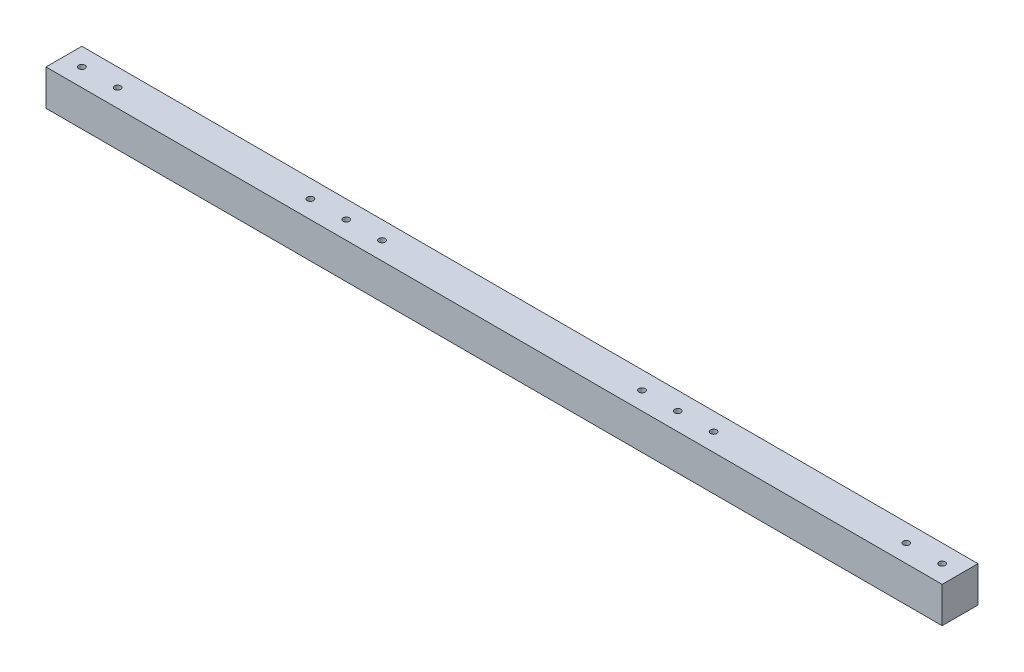
ISO-10303-21;
HEADER;
FILE_DESCRIPTION(('STEP AP214'),'2;1');
FILE_NAME('part.step','',(''),(''),'','','');
FILE_SCHEMA(('AUTOMOTIVE_DESIGN { 1 0 10303 214 1 1 1 1 }'));
ENDSEC;
DATA;
#1=APPLICATION_CONTEXT('core data for automotive mechanical design processes');
#2=APPLICATION_PROTOCOL_DEFINITION('international standard','automotive_design',2000,#1);
#3=PRODUCT_CONTEXT('',#1,'mechanical');
#4=PRODUCT('Part','Part','',(#3));
#5=PRODUCT_RELATED_PRODUCT_CATEGORY('part','',(#4));
#6=PRODUCT_DEFINITION_FORMATION('','',#4);
#7=PRODUCT_DEFINITION_CONTEXT('part definition',#1,'design');
#8=PRODUCT_DEFINITION('design','',#6,#7);
#9=PRODUCT_DEFINITION_SHAPE('','',#8);
#10=(LENGTH_UNIT() NAMED_UNIT(*) SI_UNIT(.MILLI.,.METRE.));
#11=(NAMED_UNIT(*) PLANE_ANGLE_UNIT() SI_UNIT($,.RADIAN.));
#12=(NAMED_UNIT(*) SI_UNIT($,.STERADIAN.) SOLID_ANGLE_UNIT());
#13=UNCERTAINTY_MEASURE_WITH_UNIT(LENGTH_MEASURE(1.E-05),#10,'distance_accuracy_value','');
#14=(GEOMETRIC_REPRESENTATION_CONTEXT(3) GLOBAL_UNCERTAINTY_ASSIGNED_CONTEXT((#13)) GLOBAL_UNIT_ASSIGNED_CONTEXT((#10,
#11,#12)) REPRESENTATION_CONTEXT('',''));
#15=CARTESIAN_POINT('',(0.,0.,0.));
#16=DIRECTION('',(0.,0.,1.));
#17=DIRECTION('',(1.,0.,0.));
#18=AXIS2_PLACEMENT_3D('',#15,#16,#17);
#19=CARTESIAN_POINT('',(0.,20.,0.));
#20=DIRECTION('',(0.,1.,0.));
#21=DIRECTION('',(0.,0.,1.));
#22=AXIS2_PLACEMENT_3D('',#19,#20,#21);
#23=PLANE('',#22);
#24=CARTESIAN_POINT('',(-72.5,20.,0.));
#25=DIRECTION('',(0.,1.,0.));
#26=DIRECTION('',(0.,0.,1.));
#27=AXIS2_PLACEMENT_3D('',#24,#25,#26);
#28=CIRCLE('',#27,1.75);
#29=CARTESIAN_POINT('',(-72.5,20.,1.75000000000001));
#30=VERTEX_POINT('',#29);
#31=EDGE_CURVE('E186',#30,#30,#28,.F.);
#32=ORIENTED_EDGE('',*,*,#31,.T.);
#33=EDGE_LOOP('',(#32));
#34=FACE_BOUND('',#33,.T.);
#35=CARTESIAN_POINT('',(-112.5,20.,-1.30985636173841E-13));
#36=DIRECTION('',(0.,1.,0.));
#37=DIRECTION('',(0.,0.,1.));
#38=AXIS2_PLACEMENT_3D('',#35,#36,#37);
#39=CIRCLE('',#38,1.75);
#40=CARTESIAN_POINT('',(-112.5,20.,1.74999999999987));
#41=VERTEX_POINT('',#40);
#42=EDGE_CURVE('E220',#41,#41,#39,.F.);
#43=ORIENTED_EDGE('',*,*,#42,.T.);
#44=EDGE_LOOP('',(#43));
#45=FACE_BOUND('',#44,.T.);
#46=CARTESIAN_POINT('',(112.5,20.,-1.03431083193026E-13));
#47=DIRECTION('',(0.,1.,0.));
#48=DIRECTION('',(0.,0.,1.));
#49=AXIS2_PLACEMENT_3D('',#46,#47,#48);
#50=CIRCLE('',#49,1.75);
#51=CARTESIAN_POINT('',(112.5,20.,1.74999999999989));
#52=VERTEX_POINT('',#51);
#53=EDGE_CURVE('E224',#52,#52,#50,.F.);
#54=ORIENTED_EDGE('',*,*,#53,.T.);
#55=EDGE_LOOP('',(#54));
#56=FACE_BOUND('',#55,.T.);
#57=CARTESIAN_POINT('',(92.5,20.,0.));
#58=DIRECTION('',(0.,1.,0.));
#59=DIRECTION('',(0.,0.,1.));
#60=AXIS2_PLACEMENT_3D('',#57,#58,#59);
#61=CIRCLE('',#60,1.75);
#62=CARTESIAN_POINT('',(92.5,20.,1.75000000000003));
#63=VERTEX_POINT('',#62);
#64=EDGE_CURVE('E198',#63,#63,#61,.F.);
#65=ORIENTED_EDGE('',*,*,#64,.T.);
#66=EDGE_LOOP('',(#65));
#67=FACE_BOUND('',#66,.T.);
#68=CARTESIAN_POINT('',(72.5,20.,0.));
#69=DIRECTION('',(0.,1.,0.));
#70=DIRECTION('',(0.,0.,1.));
#71=AXIS2_PLACEMENT_3D('',#68,#69,#70);
#72=CIRCLE('',#71,1.75);
#73=CARTESIAN_POINT('',(72.5,20.,1.75000000000002));
#74=VERTEX_POINT('',#73);
#75=EDGE_CURVE('E200',#74,#74,#72,.F.);
#76=ORIENTED_EDGE('',*,*,#75,.T.);
#77=EDGE_LOOP('',(#76));
#78=FACE_BOUND('',#77,.T.);
#79=CARTESIAN_POINT('',(-92.5,20.,0.));
#80=DIRECTION('',(0.,1.,0.));
#81=DIRECTION('',(0.,0.,1.));
#82=AXIS2_PLACEMENT_3D('',#79,#80,#81);
#83=CIRCLE('',#82,1.75);
#84=CARTESIAN_POINT('',(-92.5,20.,1.75000000000001));
#85=VERTEX_POINT('',#84);
#86=EDGE_CURVE('E183',#85,#85,#83,.F.);
#87=ORIENTED_EDGE('',*,*,#86,.T.);
#88=EDGE_LOOP('',(#87));
#89=FACE_BOUND('',#88,.T.);
#90=CARTESIAN_POINT('',(-240.000000000001,20.,0.));
#91=DIRECTION('',(0.,1.,0.));
#92=DIRECTION('',(0.,0.,-1.));
#93=AXIS2_PLACEMENT_3D('',#90,#91,#92);
#94=CIRCLE('',#93,1.75000000000001);
#95=CARTESIAN_POINT('',(-240.000000000001,20.,-1.75000000000001));
#96=VERTEX_POINT('',#95);
#97=EDGE_CURVE('E161',#96,#96,#94,.T.);
#98=ORIENTED_EDGE('',*,*,#97,.F.);
#99=EDGE_LOOP('',(#98));
#100=FACE_BOUND('',#99,.T.);
#101=CARTESIAN_POINT('',(240.,20.,0.));
#102=DIRECTION('',(0.,1.,0.));
#103=DIRECTION('',(0.,0.,1.));
#104=AXIS2_PLACEMENT_3D('',#101,#102,#103);
#105=CIRCLE('',#104,1.75000000000001);
#106=CARTESIAN_POINT('',(240.,20.,1.75000000000001));
#107=VERTEX_POINT('',#106);
#108=EDGE_CURVE('E122',#107,#107,#105,.T.);
#109=ORIENTED_EDGE('',*,*,#108,.F.);
#110=EDGE_LOOP('',(#109));
#111=FACE_BOUND('',#110,.T.);
#112=DIRECTION('',(0.,0.,-1.));
#113=VECTOR('',#112,1.);
#114=CARTESIAN_POINT('',(250.,20.,-10.));
#115=LINE('',#114,#113);
#116=CARTESIAN_POINT('',(250.,20.,10.));
#117=VERTEX_POINT('',#116);
#118=CARTESIAN_POINT('',(250.,20.,-10.));
#119=VERTEX_POINT('',#118);
#120=EDGE_CURVE('E102',#117,#119,#115,.T.);
#121=ORIENTED_EDGE('',*,*,#120,.T.);
#122=DIRECTION('',(-1.,0.,0.));
#123=VECTOR('',#122,1.);
#124=CARTESIAN_POINT('',(-250.,20.,-10.));
#125=LINE('',#124,#123);
#126=CARTESIAN_POINT('',(-250.,20.,-10.));
#127=VERTEX_POINT('',#126);
#128=EDGE_CURVE('E96',#119,#127,#125,.T.);
#129=ORIENTED_EDGE('',*,*,#128,.T.);
#130=DIRECTION('',(0.,0.,1.));
#131=VECTOR('',#130,1.);
#132=CARTESIAN_POINT('',(-250.,20.,-10.));
#133=LINE('',#132,#131);
#134=CARTESIAN_POINT('',(-250.,20.,10.));
#135=VERTEX_POINT('',#134);
#136=EDGE_CURVE('E98',#127,#135,#133,.T.);
#137=ORIENTED_EDGE('',*,*,#136,.T.);
#138=DIRECTION('',(1.,0.,0.));
#139=VECTOR('',#138,1.);
#140=CARTESIAN_POINT('',(-250.,20.,10.));
#141=LINE('',#140,#139);
#142=EDGE_CURVE('E67',#135,#117,#141,.T.);
#143=ORIENTED_EDGE('',*,*,#142,.T.);
#144=EDGE_LOOP('',(#121,#129,#137,#143));
#145=FACE_BOUND('',#144,.T.);
#146=CARTESIAN_POINT('',(220.,20.,1.41393977029702E-13));
#147=DIRECTION('',(0.,1.,0.));
#148=DIRECTION('',(0.,0.,1.));
#149=AXIS2_PLACEMENT_3D('',#146,#147,#148);
#150=CIRCLE('',#149,1.75000000000001);
#151=CARTESIAN_POINT('',(220.,20.,1.75000000000015));
#152=VERTEX_POINT('',#151);
#153=EDGE_CURVE('E151',#152,#152,#150,.T.);
#154=ORIENTED_EDGE('',*,*,#153,.F.);
#155=EDGE_LOOP('',(#154));
#156=FACE_BOUND('',#155,.T.);
#157=CARTESIAN_POINT('',(-220.000000000001,20.,1.41393977029702E-13));
#158=DIRECTION('',(0.,1.,0.));
#159=DIRECTION('',(0.,0.,-1.));
#160=AXIS2_PLACEMENT_3D('',#157,#158,#159);
#161=CIRCLE('',#160,1.75000000000001);
#162=CARTESIAN_POINT('',(-220.000000000001,20.,-1.74999999999987));
#163=VERTEX_POINT('',#162);
#164=EDGE_CURVE('E173',#163,#163,#161,.T.);
#165=ORIENTED_EDGE('',*,*,#164,.F.);
#166=EDGE_LOOP('',(#165));
#167=FACE_BOUND('',#166,.T.);
#168=ADVANCED_FACE('F48',(#34,#45,#56,#67,#78,#89,#100,#111,#145,#156,#167),#23,.T.);
#169=CARTESIAN_POINT('',(0.,0.,0.));
#170=DIRECTION('',(0.,1.,0.));
#171=DIRECTION('',(0.,0.,1.));
#172=AXIS2_PLACEMENT_3D('',#169,#170,#171);
#173=PLANE('',#172);
#174=CARTESIAN_POINT('',(-72.5,0.,0.));
#175=DIRECTION('',(0.,-1.,0.));
#176=DIRECTION('',(0.,0.,-1.));
#177=AXIS2_PLACEMENT_3D('',#174,#175,#176);
#178=CIRCLE('',#177,1.75);
#179=CARTESIAN_POINT('',(-72.5,0.,-1.74999999999999));
#180=VERTEX_POINT('',#179);
#181=EDGE_CURVE('E212',#180,#180,#178,.T.);
#182=ORIENTED_EDGE('',*,*,#181,.F.);
#183=EDGE_LOOP('',(#182));
#184=FACE_BOUND('',#183,.T.);
#185=CARTESIAN_POINT('',(-112.5,0.,-1.30985636173841E-13));
#186=DIRECTION('',(0.,-1.,0.));
#187=DIRECTION('',(0.,0.,-1.));
#188=AXIS2_PLACEMENT_3D('',#185,#186,#187);
#189=CIRCLE('',#188,1.75);
#190=CARTESIAN_POINT('',(-112.5,0.,-1.75000000000013));
#191=VERTEX_POINT('',#190);
#192=EDGE_CURVE('E217',#191,#191,#189,.T.);
#193=ORIENTED_EDGE('',*,*,#192,.F.);
#194=EDGE_LOOP('',(#193));
#195=FACE_BOUND('',#194,.T.);
#196=CARTESIAN_POINT('',(112.5,0.,-1.03431083193026E-13));
#197=DIRECTION('',(0.,-1.,0.));
#198=DIRECTION('',(0.,0.,1.));
#199=AXIS2_PLACEMENT_3D('',#196,#197,#198);
#200=CIRCLE('',#199,1.75);
#201=CARTESIAN_POINT('',(112.5,0.,1.74999999999989));
#202=VERTEX_POINT('',#201);
#203=EDGE_CURVE('E228',#202,#202,#200,.T.);
#204=ORIENTED_EDGE('',*,*,#203,.F.);
#205=EDGE_LOOP('',(#204));
#206=FACE_BOUND('',#205,.T.);
#207=CARTESIAN_POINT('',(92.5,0.,0.));
#208=DIRECTION('',(0.,-1.,0.));
#209=DIRECTION('',(0.,0.,1.));
#210=AXIS2_PLACEMENT_3D('',#207,#208,#209);
#211=CIRCLE('',#210,1.75);
#212=CARTESIAN_POINT('',(92.5,0.,1.75000000000003));
#213=VERTEX_POINT('',#212);
#214=EDGE_CURVE('E192',#213,#213,#211,.T.);
#215=ORIENTED_EDGE('',*,*,#214,.F.);
#216=EDGE_LOOP('',(#215));
#217=FACE_BOUND('',#216,.T.);
#218=CARTESIAN_POINT('',(72.5,0.,0.));
#219=DIRECTION('',(0.,-1.,0.));
#220=DIRECTION('',(0.,0.,1.));
#221=AXIS2_PLACEMENT_3D('',#218,#219,#220);
#222=CIRCLE('',#221,1.75);
#223=CARTESIAN_POINT('',(72.5,0.,1.75000000000002));
#224=VERTEX_POINT('',#223);
#225=EDGE_CURVE('E201',#224,#224,#222,.T.);
#226=ORIENTED_EDGE('',*,*,#225,.F.);
#227=EDGE_LOOP('',(#226));
#228=FACE_BOUND('',#227,.T.);
#229=CARTESIAN_POINT('',(-92.5,0.,0.));
#230=DIRECTION('',(0.,-1.,0.));
#231=DIRECTION('',(0.,0.,-1.));
#232=AXIS2_PLACEMENT_3D('',#229,#230,#231);
#233=CIRCLE('',#232,1.75);
#234=CARTESIAN_POINT('',(-92.5,0.,-1.74999999999999));
#235=VERTEX_POINT('',#234);
#236=EDGE_CURVE('E177',#235,#235,#233,.T.);
#237=ORIENTED_EDGE('',*,*,#236,.F.);
#238=EDGE_LOOP('',(#237));
#239=FACE_BOUND('',#238,.T.);
#240=DIRECTION('',(0.,0.,-1.));
#241=VECTOR('',#240,1.);
#242=CARTESIAN_POINT('',(250.,0.,-10.));
#243=LINE('',#242,#241);
#244=CARTESIAN_POINT('',(250.,0.,10.));
#245=VERTEX_POINT('',#244);
#246=CARTESIAN_POINT('',(250.,0.,-10.));
#247=VERTEX_POINT('',#246);
#248=EDGE_CURVE('E120',#245,#247,#243,.T.);
#249=ORIENTED_EDGE('',*,*,#248,.F.);
#250=DIRECTION('',(1.,0.,0.));
#251=VECTOR('',#250,1.);
#252=CARTESIAN_POINT('',(-250.,0.,10.));
#253=LINE('',#252,#251);
#254=CARTESIAN_POINT('',(-250.,0.,10.));
#255=VERTEX_POINT('',#254);
#256=EDGE_CURVE('E87',#255,#245,#253,.T.);
#257=ORIENTED_EDGE('',*,*,#256,.F.);
#258=DIRECTION('',(0.,0.,1.));
#259=VECTOR('',#258,1.);
#260=CARTESIAN_POINT('',(-250.,0.,-10.));
#261=LINE('',#260,#259);
#262=CARTESIAN_POINT('',(-250.,0.,-10.));
#263=VERTEX_POINT('',#262);
#264=EDGE_CURVE('E81',#263,#255,#261,.T.);
#265=ORIENTED_EDGE('',*,*,#264,.F.);
#266=DIRECTION('',(-1.,0.,0.));
#267=VECTOR('',#266,1.);
#268=CARTESIAN_POINT('',(-250.,0.,-10.));
#269=LINE('',#268,#267);
#270=EDGE_CURVE('E108',#247,#263,#269,.T.);
#271=ORIENTED_EDGE('',*,*,#270,.F.);
#272=EDGE_LOOP('',(#249,#257,#265,#271));
#273=FACE_BOUND('',#272,.T.);
#274=CARTESIAN_POINT('',(240.,0.,0.));
#275=DIRECTION('',(0.,1.,0.));
#276=DIRECTION('',(0.,0.,1.));
#277=AXIS2_PLACEMENT_3D('',#274,#275,#276);
#278=CIRCLE('',#277,1.75000000000001);
#279=CARTESIAN_POINT('',(240.,0.,1.75000000000001));
#280=VERTEX_POINT('',#279);
#281=EDGE_CURVE('E149',#280,#280,#278,.T.);
#282=ORIENTED_EDGE('',*,*,#281,.T.);
#283=EDGE_LOOP('',(#282));
#284=FACE_BOUND('',#283,.T.);
#285=CARTESIAN_POINT('',(220.,0.,1.41393977029702E-13));
#286=DIRECTION('',(0.,1.,0.));
#287=DIRECTION('',(0.,0.,1.));
#288=AXIS2_PLACEMENT_3D('',#285,#286,#287);
#289=CIRCLE('',#288,1.75000000000001);
#290=CARTESIAN_POINT('',(220.,0.,1.75000000000015));
#291=VERTEX_POINT('',#290);
#292=EDGE_CURVE('E156',#291,#291,#289,.T.);
#293=ORIENTED_EDGE('',*,*,#292,.T.);
#294=EDGE_LOOP('',(#293));
#295=FACE_BOUND('',#294,.T.);
#296=CARTESIAN_POINT('',(-240.000000000001,0.,0.));
#297=DIRECTION('',(0.,1.,0.));
#298=DIRECTION('',(0.,0.,-1.));
#299=AXIS2_PLACEMENT_3D('',#296,#297,#298);
#300=CIRCLE('',#299,1.75000000000001);
#301=CARTESIAN_POINT('',(-240.000000000001,0.,-1.75000000000001));
#302=VERTEX_POINT('',#301);
#303=EDGE_CURVE('E168',#302,#302,#300,.T.);
#304=ORIENTED_EDGE('',*,*,#303,.T.);
#305=EDGE_LOOP('',(#304));
#306=FACE_BOUND('',#305,.T.);
#307=CARTESIAN_POINT('',(-220.000000000001,0.,1.41393977029702E-13));
#308=DIRECTION('',(0.,1.,0.));
#309=DIRECTION('',(0.,0.,-1.));
#310=AXIS2_PLACEMENT_3D('',#307,#308,#309);
#311=CIRCLE('',#310,1.75000000000001);
#312=CARTESIAN_POINT('',(-220.000000000001,0.,-1.74999999999987));
#313=VERTEX_POINT('',#312);
#314=EDGE_CURVE('E174',#313,#313,#311,.T.);
#315=ORIENTED_EDGE('',*,*,#314,.T.);
#316=EDGE_LOOP('',(#315));
#317=FACE_BOUND('',#316,.T.);
#318=ADVANCED_FACE('F142',(#184,#195,#206,#217,#228,#239,#273,#284,#295,#306,#317),#173,.F.);
#319=CARTESIAN_POINT('',(250.,20.,-10.));
#320=DIRECTION('',(-1.,0.,0.));
#321=DIRECTION('',(0.,0.,1.));
#322=AXIS2_PLACEMENT_3D('',#319,#320,#321);
#323=PLANE('',#322);
#324=ORIENTED_EDGE('',*,*,#248,.T.);
#325=DIRECTION('',(0.,-1.,0.));
#326=VECTOR('',#325,1.);
#327=CARTESIAN_POINT('',(250.,20.,-10.));
#328=LINE('',#327,#326);
#329=EDGE_CURVE('E12',#119,#247,#328,.T.);
#330=ORIENTED_EDGE('',*,*,#329,.F.);
#331=ORIENTED_EDGE('',*,*,#120,.F.);
#332=DIRECTION('',(0.,-1.,0.));
#333=VECTOR('',#332,1.);
#334=CARTESIAN_POINT('',(250.,20.,10.));
#335=LINE('',#334,#333);
#336=EDGE_CURVE('E111',#117,#245,#335,.T.);
#337=ORIENTED_EDGE('',*,*,#336,.T.);
#338=EDGE_LOOP('',(#324,#330,#331,#337));
#339=FACE_BOUND('',#338,.T.);
#340=ADVANCED_FACE('F49',(#339),#323,.F.);
#341=CARTESIAN_POINT('',(-250.,20.,-10.));
#342=DIRECTION('',(0.,0.,1.));
#343=DIRECTION('',(1.,0.,0.));
#344=AXIS2_PLACEMENT_3D('',#341,#342,#343);
#345=PLANE('',#344);
#346=ORIENTED_EDGE('',*,*,#270,.T.);
#347=DIRECTION('',(0.,-1.,0.));
#348=VECTOR('',#347,1.);
#349=CARTESIAN_POINT('',(-250.,20.,-10.));
#350=LINE('',#349,#348);
#351=EDGE_CURVE('E59',#127,#263,#350,.T.);
#352=ORIENTED_EDGE('',*,*,#351,.F.);
#353=ORIENTED_EDGE('',*,*,#128,.F.);
#354=ORIENTED_EDGE('',*,*,#329,.T.);
#355=EDGE_LOOP('',(#346,#352,#353,#354));
#356=FACE_BOUND('',#355,.T.);
#357=ADVANCED_FACE('F103',(#356),#345,.F.);
#358=CARTESIAN_POINT('',(-250.,20.,-10.));
#359=DIRECTION('',(1.,0.,0.));
#360=DIRECTION('',(0.,0.,-1.));
#361=AXIS2_PLACEMENT_3D('',#358,#359,#360);
#362=PLANE('',#361);
#363=ORIENTED_EDGE('',*,*,#264,.T.);
#364=DIRECTION('',(0.,-1.,0.));
#365=VECTOR('',#364,1.);
#366=CARTESIAN_POINT('',(-250.,20.,10.));
#367=LINE('',#366,#365);
#368=EDGE_CURVE('E106',#135,#255,#367,.T.);
#369=ORIENTED_EDGE('',*,*,#368,.F.);
#370=ORIENTED_EDGE('',*,*,#136,.F.);
#371=ORIENTED_EDGE('',*,*,#351,.T.);
#372=EDGE_LOOP('',(#363,#369,#370,#371));
#373=FACE_BOUND('',#372,.T.);
#374=ADVANCED_FACE('F107',(#373),#362,.F.);
#375=CARTESIAN_POINT('',(-250.,20.,10.));
#376=DIRECTION('',(0.,0.,-1.));
#377=DIRECTION('',(-1.,0.,0.));
#378=AXIS2_PLACEMENT_3D('',#375,#376,#377);
#379=PLANE('',#378);
#380=ORIENTED_EDGE('',*,*,#256,.T.);
#381=ORIENTED_EDGE('',*,*,#336,.F.);
#382=ORIENTED_EDGE('',*,*,#142,.F.);
#383=ORIENTED_EDGE('',*,*,#368,.T.);
#384=EDGE_LOOP('',(#380,#381,#382,#383));
#385=FACE_BOUND('',#384,.T.);
#386=ADVANCED_FACE('F139',(#385),#379,.F.);
#387=CARTESIAN_POINT('',(240.,20.,0.));
#388=DIRECTION('',(0.,-1.,0.));
#389=DIRECTION('',(0.,0.,-1.));
#390=AXIS2_PLACEMENT_3D('',#387,#388,#389);
#391=CYLINDRICAL_SURFACE('',#390,1.75000000000001);
#392=ORIENTED_EDGE('',*,*,#108,.T.);
#393=EDGE_LOOP('',(#392));
#394=FACE_BOUND('',#393,.T.);
#395=ORIENTED_EDGE('',*,*,#281,.F.);
#396=EDGE_LOOP('',(#395));
#397=FACE_BOUND('',#396,.T.);
#398=ADVANCED_FACE('F277',(#394,#397),#391,.F.);
#399=CARTESIAN_POINT('',(220.,20.,1.41393977029702E-13));
#400=DIRECTION('',(0.,-1.,0.));
#401=DIRECTION('',(0.,0.,-1.));
#402=AXIS2_PLACEMENT_3D('',#399,#400,#401);
#403=CYLINDRICAL_SURFACE('',#402,1.75000000000001);
#404=ORIENTED_EDGE('',*,*,#153,.T.);
#405=EDGE_LOOP('',(#404));
#406=FACE_BOUND('',#405,.T.);
#407=ORIENTED_EDGE('',*,*,#292,.F.);
#408=EDGE_LOOP('',(#407));
#409=FACE_BOUND('',#408,.T.);
#410=ADVANCED_FACE('F319',(#406,#409),#403,.F.);
#411=CARTESIAN_POINT('',(-240.000000000001,20.,0.));
#412=DIRECTION('',(0.,-1.,0.));
#413=DIRECTION('',(0.,0.,-1.));
#414=AXIS2_PLACEMENT_3D('',#411,#412,#413);
#415=CYLINDRICAL_SURFACE('',#414,1.75000000000001);
#416=ORIENTED_EDGE('',*,*,#97,.T.);
#417=EDGE_LOOP('',(#416));
#418=FACE_BOUND('',#417,.T.);
#419=ORIENTED_EDGE('',*,*,#303,.F.);
#420=EDGE_LOOP('',(#419));
#421=FACE_BOUND('',#420,.T.);
#422=ADVANCED_FACE('F270',(#418,#421),#415,.F.);
#423=CARTESIAN_POINT('',(-220.000000000001,20.,1.41393977029702E-13));
#424=DIRECTION('',(0.,-1.,0.));
#425=DIRECTION('',(0.,0.,-1.));
#426=AXIS2_PLACEMENT_3D('',#423,#424,#425);
#427=CYLINDRICAL_SURFACE('',#426,1.75000000000001);
#428=ORIENTED_EDGE('',*,*,#164,.T.);
#429=EDGE_LOOP('',(#428));
#430=FACE_BOUND('',#429,.T.);
#431=ORIENTED_EDGE('',*,*,#314,.F.);
#432=EDGE_LOOP('',(#431));
#433=FACE_BOUND('',#432,.T.);
#434=ADVANCED_FACE('F256',(#430,#433),#427,.F.);
#435=CARTESIAN_POINT('',(-92.5,20.001,0.));
#436=DIRECTION('',(0.,-1.,0.));
#437=DIRECTION('',(0.,0.,-1.));
#438=AXIS2_PLACEMENT_3D('',#435,#436,#437);
#439=CYLINDRICAL_SURFACE('',#438,1.75);
#440=ORIENTED_EDGE('',*,*,#86,.F.);
#441=EDGE_LOOP('',(#440));
#442=FACE_BOUND('',#441,.T.);
#443=ORIENTED_EDGE('',*,*,#236,.T.);
#444=EDGE_LOOP('',(#443));
#445=FACE_BOUND('',#444,.T.);
#446=ADVANCED_FACE('F258',(#442,#445),#439,.F.);
#447=CARTESIAN_POINT('',(72.5,20.001,0.));
#448=DIRECTION('',(0.,-1.,0.));
#449=DIRECTION('',(0.,0.,-1.));
#450=AXIS2_PLACEMENT_3D('',#447,#448,#449);
#451=CYLINDRICAL_SURFACE('',#450,1.75);
#452=ORIENTED_EDGE('',*,*,#75,.F.);
#453=EDGE_LOOP('',(#452));
#454=FACE_BOUND('',#453,.T.);
#455=ORIENTED_EDGE('',*,*,#225,.T.);
#456=EDGE_LOOP('',(#455));
#457=FACE_BOUND('',#456,.T.);
#458=ADVANCED_FACE('F242',(#454,#457),#451,.F.);
#459=CARTESIAN_POINT('',(92.5,20.001,0.));
#460=DIRECTION('',(0.,-1.,0.));
#461=DIRECTION('',(0.,0.,-1.));
#462=AXIS2_PLACEMENT_3D('',#459,#460,#461);
#463=CYLINDRICAL_SURFACE('',#462,1.75);
#464=ORIENTED_EDGE('',*,*,#64,.F.);
#465=EDGE_LOOP('',(#464));
#466=FACE_BOUND('',#465,.T.);
#467=ORIENTED_EDGE('',*,*,#214,.T.);
#468=EDGE_LOOP('',(#467));
#469=FACE_BOUND('',#468,.T.);
#470=ADVANCED_FACE('F238',(#466,#469),#463,.F.);
#471=CARTESIAN_POINT('',(112.5,20.001,-1.03431083193026E-13));
#472=DIRECTION('',(0.,-1.,0.));
#473=DIRECTION('',(0.,0.,-1.));
#474=AXIS2_PLACEMENT_3D('',#471,#472,#473);
#475=CYLINDRICAL_SURFACE('',#474,1.75);
#476=ORIENTED_EDGE('',*,*,#53,.F.);
#477=EDGE_LOOP('',(#476));
#478=FACE_BOUND('',#477,.T.);
#479=ORIENTED_EDGE('',*,*,#203,.T.);
#480=EDGE_LOOP('',(#479));
#481=FACE_BOUND('',#480,.T.);
#482=ADVANCED_FACE('F241',(#478,#481),#475,.F.);
#483=CARTESIAN_POINT('',(-112.5,20.001,-1.30985636173841E-13));
#484=DIRECTION('',(0.,-1.,0.));
#485=DIRECTION('',(0.,0.,-1.));
#486=AXIS2_PLACEMENT_3D('',#483,#484,#485);
#487=CYLINDRICAL_SURFACE('',#486,1.75);
#488=ORIENTED_EDGE('',*,*,#42,.F.);
#489=EDGE_LOOP('',(#488));
#490=FACE_BOUND('',#489,.T.);
#491=ORIENTED_EDGE('',*,*,#192,.T.);
#492=EDGE_LOOP('',(#491));
#493=FACE_BOUND('',#492,.T.);
#494=ADVANCED_FACE('F367',(#490,#493),#487,.F.);
#495=CARTESIAN_POINT('',(-72.5,20.001,0.));
#496=DIRECTION('',(0.,-1.,0.));
#497=DIRECTION('',(0.,0.,-1.));
#498=AXIS2_PLACEMENT_3D('',#495,#496,#497);
#499=CYLINDRICAL_SURFACE('',#498,1.75);
#500=ORIENTED_EDGE('',*,*,#31,.F.);
#501=EDGE_LOOP('',(#500));
#502=FACE_BOUND('',#501,.T.);
#503=ORIENTED_EDGE('',*,*,#181,.T.);
#504=EDGE_LOOP('',(#503));
#505=FACE_BOUND('',#504,.T.);
#506=ADVANCED_FACE('F376',(#502,#505),#499,.F.);
#507=CLOSED_SHELL('',(#168,#318,#340,#357,#374,#386,#398,#410,#422,#434,#446,#458,#470,#482,
#494,#506));
#508=MANIFOLD_SOLID_BREP('B2',#507);
#509=ADVANCED_BREP_SHAPE_REPRESENTATION('',(#18,#508),#14);
#510=SHAPE_DEFINITION_REPRESENTATION(#9,#509);
ENDSEC;
END-ISO-10303-21;
